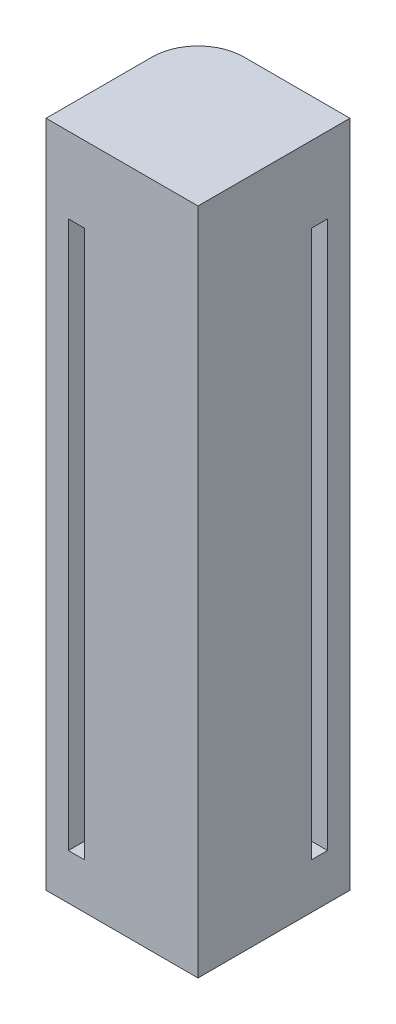
ISO-10303-21;
HEADER;
FILE_DESCRIPTION(('STEP AP214'),'2;1');
FILE_NAME('part.step','',(''),(''),'','','');
FILE_SCHEMA(('AUTOMOTIVE_DESIGN { 1 0 10303 214 1 1 1 1 }'));
ENDSEC;
DATA;
#1=APPLICATION_CONTEXT('core data for automotive mechanical design processes');
#2=APPLICATION_PROTOCOL_DEFINITION('international standard','automotive_design',2000,#1);
#3=PRODUCT_CONTEXT('',#1,'mechanical');
#4=PRODUCT('Part','Part','',(#3));
#5=PRODUCT_RELATED_PRODUCT_CATEGORY('part','',(#4));
#6=PRODUCT_DEFINITION_FORMATION('','',#4);
#7=PRODUCT_DEFINITION_CONTEXT('part definition',#1,'design');
#8=PRODUCT_DEFINITION('design','',#6,#7);
#9=PRODUCT_DEFINITION_SHAPE('','',#8);
#10=(LENGTH_UNIT() NAMED_UNIT(*) SI_UNIT(.MILLI.,.METRE.));
#11=(NAMED_UNIT(*) PLANE_ANGLE_UNIT() SI_UNIT($,.RADIAN.));
#12=(NAMED_UNIT(*) SI_UNIT($,.STERADIAN.) SOLID_ANGLE_UNIT());
#13=UNCERTAINTY_MEASURE_WITH_UNIT(LENGTH_MEASURE(1.E-05),#10,'distance_accuracy_value','');
#14=(GEOMETRIC_REPRESENTATION_CONTEXT(3) GLOBAL_UNCERTAINTY_ASSIGNED_CONTEXT((#13)) GLOBAL_UNIT_ASSIGNED_CONTEXT((#10,
#11,#12)) REPRESENTATION_CONTEXT('',''));
#15=CARTESIAN_POINT('',(0.,0.,0.));
#16=DIRECTION('',(0.,0.,1.));
#17=DIRECTION('',(1.,0.,0.));
#18=AXIS2_PLACEMENT_3D('',#15,#16,#17);
#19=CARTESIAN_POINT('',(0.,139.7,0.));
#20=DIRECTION('',(0.,1.,0.));
#21=DIRECTION('',(0.,0.,1.));
#22=AXIS2_PLACEMENT_3D('',#19,#20,#21);
#23=PLANE('',#22);
#24=DIRECTION('',(1.,0.,0.));
#25=VECTOR('',#24,1.);
#26=CARTESIAN_POINT('',(-228.6,139.7,15.875));
#27=LINE('',#26,#25);
#28=CARTESIAN_POINT('',(-260.35,139.7,15.875));
#29=VERTEX_POINT('',#28);
#30=CARTESIAN_POINT('',(-228.6,139.7,15.875));
#31=VERTEX_POINT('',#30);
#32=EDGE_CURVE('E158',#29,#31,#27,.T.);
#33=ORIENTED_EDGE('',*,*,#32,.T.);
#34=DIRECTION('',(0.,0.,-1.));
#35=VECTOR('',#34,1.);
#36=CARTESIAN_POINT('',(-228.6,139.7,15.875));
#37=LINE('',#36,#35);
#38=CARTESIAN_POINT('',(-228.6,139.7,-15.875));
#39=VERTEX_POINT('',#38);
#40=EDGE_CURVE('E142',#31,#39,#37,.T.);
#41=ORIENTED_EDGE('',*,*,#40,.T.);
#42=DIRECTION('',(-1.,0.,0.));
#43=VECTOR('',#42,1.);
#44=CARTESIAN_POINT('',(-228.6,139.7,-15.875));
#45=LINE('',#44,#43);
#46=CARTESIAN_POINT('',(-250.825,139.7,-15.875));
#47=VERTEX_POINT('',#46);
#48=EDGE_CURVE('E153',#39,#47,#45,.T.);
#49=ORIENTED_EDGE('',*,*,#48,.T.);
#50=CARTESIAN_POINT('',(-250.825,139.7,-6.35));
#51=DIRECTION('',(0.,1.,0.));
#52=DIRECTION('',(0.,0.,1.));
#53=AXIS2_PLACEMENT_3D('',#50,#51,#52);
#54=CIRCLE('',#53,9.525);
#55=CARTESIAN_POINT('',(-260.35,139.7,-6.35));
#56=VERTEX_POINT('',#55);
#57=EDGE_CURVE('E232',#56,#47,#54,.F.);
#58=ORIENTED_EDGE('',*,*,#57,.F.);
#59=DIRECTION('',(0.,0.,-1.));
#60=VECTOR('',#59,1.);
#61=CARTESIAN_POINT('',(-260.35,139.7,0.));
#62=LINE('',#61,#60);
#63=EDGE_CURVE('E157',#29,#56,#62,.T.);
#64=ORIENTED_EDGE('',*,*,#63,.F.);
#65=EDGE_LOOP('',(#33,#41,#49,#58,#64));
#66=FACE_BOUND('',#65,.T.);
#67=ADVANCED_FACE('F34',(#66),#23,.T.);
#68=CARTESIAN_POINT('',(-254.,0.,3.175));
#69=DIRECTION('',(0.,0.,1.));
#70=DIRECTION('',(-1.,0.,0.));
#71=AXIS2_PLACEMENT_3D('',#68,#69,#70);
#72=PLANE('',#71);
#73=DIRECTION('',(0.,1.,0.));
#74=VECTOR('',#73,1.);
#75=CARTESIAN_POINT('',(-255.6764,123.825,3.175));
#76=LINE('',#75,#74);
#77=CARTESIAN_POINT('',(-255.6764,9.52500000000001,3.175));
#78=VERTEX_POINT('',#77);
#79=CARTESIAN_POINT('',(-255.6764,123.825,3.175));
#80=VERTEX_POINT('',#79);
#81=EDGE_CURVE('E194',#78,#80,#76,.T.);
#82=ORIENTED_EDGE('',*,*,#81,.F.);
#83=DIRECTION('',(-1.,0.,0.));
#84=VECTOR('',#83,1.);
#85=CARTESIAN_POINT('',(-252.3236,9.52500000000001,3.175));
#86=LINE('',#85,#84);
#87=CARTESIAN_POINT('',(-252.3236,9.52500000000001,3.175));
#88=VERTEX_POINT('',#87);
#89=EDGE_CURVE('E184',#88,#78,#86,.T.);
#90=ORIENTED_EDGE('',*,*,#89,.F.);
#91=DIRECTION('',(0.,-1.,0.));
#92=VECTOR('',#91,1.);
#93=CARTESIAN_POINT('',(-252.3236,123.825,3.175));
#94=LINE('',#93,#92);
#95=CARTESIAN_POINT('',(-252.3236,123.825,3.175));
#96=VERTEX_POINT('',#95);
#97=EDGE_CURVE('E204',#96,#88,#94,.T.);
#98=ORIENTED_EDGE('',*,*,#97,.F.);
#99=DIRECTION('',(1.,0.,0.));
#100=VECTOR('',#99,1.);
#101=CARTESIAN_POINT('',(-252.3236,123.825,3.175));
#102=LINE('',#101,#100);
#103=EDGE_CURVE('E206',#80,#96,#102,.T.);
#104=ORIENTED_EDGE('',*,*,#103,.F.);
#105=EDGE_LOOP('',(#82,#90,#98,#104));
#106=FACE_BOUND('',#105,.T.);
#107=ADVANCED_FACE('F255',(#106),#72,.T.);
#108=CARTESIAN_POINT('',(-241.3,0.,0.));
#109=DIRECTION('',(-1.,0.,0.));
#110=DIRECTION('',(0.,0.,-1.));
#111=AXIS2_PLACEMENT_3D('',#108,#109,#110);
#112=PLANE('',#111);
#113=DIRECTION('',(0.,-1.,0.));
#114=VECTOR('',#113,1.);
#115=CARTESIAN_POINT('',(-241.3,9.525,-11.2014));
#116=LINE('',#115,#114);
#117=CARTESIAN_POINT('',(-241.3,123.825,-11.2014));
#118=VERTEX_POINT('',#117);
#119=CARTESIAN_POINT('',(-241.3,9.525,-11.2014));
#120=VERTEX_POINT('',#119);
#121=EDGE_CURVE('E221',#118,#120,#116,.T.);
#122=ORIENTED_EDGE('',*,*,#121,.F.);
#123=DIRECTION('',(0.,0.,-1.));
#124=VECTOR('',#123,1.);
#125=CARTESIAN_POINT('',(-241.3,123.825,-11.2014));
#126=LINE('',#125,#124);
#127=CARTESIAN_POINT('',(-241.3,123.825,-7.84860000000001));
#128=VERTEX_POINT('',#127);
#129=EDGE_CURVE('E212',#128,#118,#126,.T.);
#130=ORIENTED_EDGE('',*,*,#129,.F.);
#131=DIRECTION('',(0.,1.,0.));
#132=VECTOR('',#131,1.);
#133=CARTESIAN_POINT('',(-241.3,9.525,-7.84859999999997));
#134=LINE('',#133,#132);
#135=CARTESIAN_POINT('',(-241.3,9.525,-7.84859999999997));
#136=VERTEX_POINT('',#135);
#137=EDGE_CURVE('E227',#136,#128,#134,.T.);
#138=ORIENTED_EDGE('',*,*,#137,.F.);
#139=DIRECTION('',(0.,0.,1.));
#140=VECTOR('',#139,1.);
#141=CARTESIAN_POINT('',(-241.3,9.525,-11.2014));
#142=LINE('',#141,#140);
#143=EDGE_CURVE('E69',#120,#136,#142,.T.);
#144=ORIENTED_EDGE('',*,*,#143,.F.);
#145=EDGE_LOOP('',(#122,#130,#138,#144));
#146=FACE_BOUND('',#145,.T.);
#147=ADVANCED_FACE('F257',(#146),#112,.F.);
#148=CARTESIAN_POINT('',(-255.6764,123.825,3.175));
#149=DIRECTION('',(-1.,0.,0.));
#150=DIRECTION('',(0.,1.,0.));
#151=AXIS2_PLACEMENT_3D('',#148,#149,#150);
#152=PLANE('',#151);
#153=DIRECTION('',(0.,1.,0.));
#154=VECTOR('',#153,1.);
#155=CARTESIAN_POINT('',(-255.6764,123.825,15.875));
#156=LINE('',#155,#154);
#157=CARTESIAN_POINT('',(-255.6764,9.52500000000001,15.875));
#158=VERTEX_POINT('',#157);
#159=CARTESIAN_POINT('',(-255.6764,123.825,15.875));
#160=VERTEX_POINT('',#159);
#161=EDGE_CURVE('E200',#158,#160,#156,.T.);
#162=ORIENTED_EDGE('',*,*,#161,.F.);
#163=DIRECTION('',(0.,0.,1.));
#164=VECTOR('',#163,1.);
#165=CARTESIAN_POINT('',(-255.6764,9.52500000000001,3.175));
#166=LINE('',#165,#164);
#167=EDGE_CURVE('E181',#78,#158,#166,.T.);
#168=ORIENTED_EDGE('',*,*,#167,.F.);
#169=ORIENTED_EDGE('',*,*,#81,.T.);
#170=DIRECTION('',(0.,0.,1.));
#171=VECTOR('',#170,1.);
#172=CARTESIAN_POINT('',(-255.6764,123.825,3.175));
#173=LINE('',#172,#171);
#174=EDGE_CURVE('E182',#80,#160,#173,.T.);
#175=ORIENTED_EDGE('',*,*,#174,.T.);
#176=EDGE_LOOP('',(#162,#168,#169,#175));
#177=FACE_BOUND('',#176,.T.);
#178=ADVANCED_FACE('F264',(#177),#152,.F.);
#179=CARTESIAN_POINT('',(-252.3236,9.52500000000001,3.175));
#180=DIRECTION('',(0.,-1.,0.));
#181=DIRECTION('',(0.,0.,-1.));
#182=AXIS2_PLACEMENT_3D('',#179,#180,#181);
#183=PLANE('',#182);
#184=DIRECTION('',(-1.,0.,0.));
#185=VECTOR('',#184,1.);
#186=CARTESIAN_POINT('',(-252.3236,9.52500000000001,15.875));
#187=LINE('',#186,#185);
#188=CARTESIAN_POINT('',(-252.3236,9.52500000000001,15.875));
#189=VERTEX_POINT('',#188);
#190=EDGE_CURVE('E190',#189,#158,#187,.T.);
#191=ORIENTED_EDGE('',*,*,#190,.F.);
#192=DIRECTION('',(0.,0.,1.));
#193=VECTOR('',#192,1.);
#194=CARTESIAN_POINT('',(-252.3236,9.52500000000001,3.175));
#195=LINE('',#194,#193);
#196=EDGE_CURVE('E187',#88,#189,#195,.T.);
#197=ORIENTED_EDGE('',*,*,#196,.F.);
#198=ORIENTED_EDGE('',*,*,#89,.T.);
#199=ORIENTED_EDGE('',*,*,#167,.T.);
#200=EDGE_LOOP('',(#191,#197,#198,#199));
#201=FACE_BOUND('',#200,.T.);
#202=ADVANCED_FACE('F271',(#201),#183,.F.);
#203=CARTESIAN_POINT('',(-252.3236,123.825,3.175));
#204=DIRECTION('',(1.,0.,0.));
#205=DIRECTION('',(0.,-1.,0.));
#206=AXIS2_PLACEMENT_3D('',#203,#204,#205);
#207=PLANE('',#206);
#208=DIRECTION('',(0.,-1.,0.));
#209=VECTOR('',#208,1.);
#210=CARTESIAN_POINT('',(-252.3236,123.825,15.875));
#211=LINE('',#210,#209);
#212=CARTESIAN_POINT('',(-252.3236,123.825,15.875));
#213=VERTEX_POINT('',#212);
#214=EDGE_CURVE('E193',#213,#189,#211,.T.);
#215=ORIENTED_EDGE('',*,*,#214,.F.);
#216=DIRECTION('',(0.,0.,1.));
#217=VECTOR('',#216,1.);
#218=CARTESIAN_POINT('',(-252.3236,123.825,3.175));
#219=LINE('',#218,#217);
#220=EDGE_CURVE('E185',#96,#213,#219,.T.);
#221=ORIENTED_EDGE('',*,*,#220,.F.);
#222=ORIENTED_EDGE('',*,*,#97,.T.);
#223=ORIENTED_EDGE('',*,*,#196,.T.);
#224=EDGE_LOOP('',(#215,#221,#222,#223));
#225=FACE_BOUND('',#224,.T.);
#226=ADVANCED_FACE('F354',(#225),#207,.F.);
#227=CARTESIAN_POINT('',(-252.3236,123.825,3.175));
#228=DIRECTION('',(0.,1.,0.));
#229=DIRECTION('',(0.,0.,1.));
#230=AXIS2_PLACEMENT_3D('',#227,#228,#229);
#231=PLANE('',#230);
#232=DIRECTION('',(1.,0.,0.));
#233=VECTOR('',#232,1.);
#234=CARTESIAN_POINT('',(-252.3236,123.825,15.875));
#235=LINE('',#234,#233);
#236=EDGE_CURVE('E197',#160,#213,#235,.T.);
#237=ORIENTED_EDGE('',*,*,#236,.F.);
#238=ORIENTED_EDGE('',*,*,#174,.F.);
#239=ORIENTED_EDGE('',*,*,#103,.T.);
#240=ORIENTED_EDGE('',*,*,#220,.T.);
#241=EDGE_LOOP('',(#237,#238,#239,#240));
#242=FACE_BOUND('',#241,.T.);
#243=ADVANCED_FACE('F251',(#242),#231,.F.);
#244=CARTESIAN_POINT('',(-228.6,279.4,15.875));
#245=DIRECTION('',(0.,0.,-1.));
#246=DIRECTION('',(1.,0.,0.));
#247=AXIS2_PLACEMENT_3D('',#244,#245,#246);
#248=PLANE('',#247);
#249=ORIENTED_EDGE('',*,*,#236,.T.);
#250=ORIENTED_EDGE('',*,*,#214,.T.);
#251=ORIENTED_EDGE('',*,*,#190,.T.);
#252=ORIENTED_EDGE('',*,*,#161,.T.);
#253=EDGE_LOOP('',(#249,#250,#251,#252));
#254=FACE_BOUND('',#253,.T.);
#255=ORIENTED_EDGE('',*,*,#32,.F.);
#256=DIRECTION('',(0.,-1.,0.));
#257=VECTOR('',#256,1.);
#258=CARTESIAN_POINT('',(-260.35,279.4,15.875));
#259=LINE('',#258,#257);
#260=CARTESIAN_POINT('',(-260.35,0.,15.875));
#261=VERTEX_POINT('',#260);
#262=EDGE_CURVE('E38',#29,#261,#259,.T.);
#263=ORIENTED_EDGE('',*,*,#262,.T.);
#264=DIRECTION('',(-1.,0.,0.));
#265=VECTOR('',#264,1.);
#266=CARTESIAN_POINT('',(-228.6,0.,15.875));
#267=LINE('',#266,#265);
#268=CARTESIAN_POINT('',(-228.6,0.,15.875));
#269=VERTEX_POINT('',#268);
#270=EDGE_CURVE('E169',#269,#261,#267,.T.);
#271=ORIENTED_EDGE('',*,*,#270,.F.);
#272=DIRECTION('',(0.,-1.,0.));
#273=VECTOR('',#272,1.);
#274=CARTESIAN_POINT('',(-228.6,279.4,15.875));
#275=LINE('',#274,#273);
#276=EDGE_CURVE('E148',#31,#269,#275,.T.);
#277=ORIENTED_EDGE('',*,*,#276,.F.);
#278=EDGE_LOOP('',(#255,#263,#271,#277));
#279=FACE_BOUND('',#278,.T.);
#280=ADVANCED_FACE('F244',(#254,#279),#248,.F.);
#281=CARTESIAN_POINT('',(-254.,0.,0.));
#282=DIRECTION('',(0.,-1.,0.));
#283=DIRECTION('',(0.,0.,-1.));
#284=AXIS2_PLACEMENT_3D('',#281,#282,#283);
#285=PLANE('',#284);
#286=DIRECTION('',(1.,0.,0.));
#287=VECTOR('',#286,1.);
#288=CARTESIAN_POINT('',(-228.6,0.,-15.875));
#289=LINE('',#288,#287);
#290=CARTESIAN_POINT('',(-250.825,0.,-15.875));
#291=VERTEX_POINT('',#290);
#292=CARTESIAN_POINT('',(-228.6,0.,-15.875));
#293=VERTEX_POINT('',#292);
#294=EDGE_CURVE('E175',#291,#293,#289,.T.);
#295=ORIENTED_EDGE('',*,*,#294,.T.);
#296=DIRECTION('',(0.,0.,1.));
#297=VECTOR('',#296,1.);
#298=CARTESIAN_POINT('',(-228.6,0.,15.875));
#299=LINE('',#298,#297);
#300=EDGE_CURVE('E144',#293,#269,#299,.T.);
#301=ORIENTED_EDGE('',*,*,#300,.T.);
#302=ORIENTED_EDGE('',*,*,#270,.T.);
#303=DIRECTION('',(0.,0.,1.));
#304=VECTOR('',#303,1.);
#305=CARTESIAN_POINT('',(-260.35,0.,0.));
#306=LINE('',#305,#304);
#307=CARTESIAN_POINT('',(-260.35,0.,-6.35));
#308=VERTEX_POINT('',#307);
#309=EDGE_CURVE('E149',#308,#261,#306,.T.);
#310=ORIENTED_EDGE('',*,*,#309,.F.);
#311=CARTESIAN_POINT('',(-250.825,0.,-6.35));
#312=DIRECTION('',(0.,1.,0.));
#313=DIRECTION('',(0.,0.,-1.));
#314=AXIS2_PLACEMENT_3D('',#311,#312,#313);
#315=CIRCLE('',#314,9.525);
#316=EDGE_CURVE('E168',#291,#308,#315,.T.);
#317=ORIENTED_EDGE('',*,*,#316,.F.);
#318=EDGE_LOOP('',(#295,#301,#302,#310,#317));
#319=FACE_BOUND('',#318,.T.);
#320=ADVANCED_FACE('F242',(#319),#285,.T.);
#321=CARTESIAN_POINT('',(-228.6,279.4,-15.875));
#322=DIRECTION('',(0.,0.,1.));
#323=DIRECTION('',(-1.,0.,0.));
#324=AXIS2_PLACEMENT_3D('',#321,#322,#323);
#325=PLANE('',#324);
#326=ORIENTED_EDGE('',*,*,#48,.F.);
#327=DIRECTION('',(0.,-1.,0.));
#328=VECTOR('',#327,1.);
#329=CARTESIAN_POINT('',(-228.6,279.4,-15.875));
#330=LINE('',#329,#328);
#331=EDGE_CURVE('E138',#39,#293,#330,.T.);
#332=ORIENTED_EDGE('',*,*,#331,.T.);
#333=ORIENTED_EDGE('',*,*,#294,.F.);
#334=DIRECTION('',(0.,1.,0.));
#335=VECTOR('',#334,1.);
#336=CARTESIAN_POINT('',(-250.825,0.,-15.875));
#337=LINE('',#336,#335);
#338=EDGE_CURVE('E155',#47,#291,#337,.F.);
#339=ORIENTED_EDGE('',*,*,#338,.F.);
#340=EDGE_LOOP('',(#326,#332,#333,#339));
#341=FACE_BOUND('',#340,.T.);
#342=ADVANCED_FACE('F154',(#341),#325,.F.);
#343=CARTESIAN_POINT('',(-260.35,0.,0.));
#344=DIRECTION('',(-1.,0.,0.));
#345=DIRECTION('',(0.,0.,-1.));
#346=AXIS2_PLACEMENT_3D('',#343,#344,#345);
#347=PLANE('',#346);
#348=ORIENTED_EDGE('',*,*,#262,.F.);
#349=ORIENTED_EDGE('',*,*,#63,.T.);
#350=DIRECTION('',(0.,1.,0.));
#351=VECTOR('',#350,1.);
#352=CARTESIAN_POINT('',(-260.35,292.1,-6.35));
#353=LINE('',#352,#351);
#354=EDGE_CURVE('E165',#308,#56,#353,.T.);
#355=ORIENTED_EDGE('',*,*,#354,.F.);
#356=ORIENTED_EDGE('',*,*,#309,.T.);
#357=EDGE_LOOP('',(#348,#349,#355,#356));
#358=FACE_BOUND('',#357,.T.);
#359=ADVANCED_FACE('F237',(#358),#347,.T.);
#360=CARTESIAN_POINT('',(-250.825,0.,-6.35));
#361=DIRECTION('',(0.,-1.,0.));
#362=DIRECTION('',(0.,0.,-1.));
#363=AXIS2_PLACEMENT_3D('',#360,#361,#362);
#364=CYLINDRICAL_SURFACE('',#363,9.525);
#365=ORIENTED_EDGE('',*,*,#354,.T.);
#366=ORIENTED_EDGE('',*,*,#57,.T.);
#367=ORIENTED_EDGE('',*,*,#338,.T.);
#368=ORIENTED_EDGE('',*,*,#316,.T.);
#369=EDGE_LOOP('',(#365,#366,#367,#368));
#370=FACE_BOUND('',#369,.T.);
#371=ADVANCED_FACE('F36',(#370),#364,.T.);
#372=CARTESIAN_POINT('',(-241.3,9.525,-11.2014));
#373=DIRECTION('',(0.,0.,-1.));
#374=DIRECTION('',(0.,1.,0.));
#375=AXIS2_PLACEMENT_3D('',#372,#373,#374);
#376=PLANE('',#375);
#377=DIRECTION('',(0.,-1.,0.));
#378=VECTOR('',#377,1.);
#379=CARTESIAN_POINT('',(-228.6,9.525,-11.2014));
#380=LINE('',#379,#378);
#381=CARTESIAN_POINT('',(-228.6,123.825,-11.2014));
#382=VERTEX_POINT('',#381);
#383=CARTESIAN_POINT('',(-228.6,9.52500000000001,-11.2014));
#384=VERTEX_POINT('',#383);
#385=EDGE_CURVE('E11',#382,#384,#380,.T.);
#386=ORIENTED_EDGE('',*,*,#385,.F.);
#387=DIRECTION('',(1.,0.,0.));
#388=VECTOR('',#387,1.);
#389=CARTESIAN_POINT('',(-241.3,123.825,-11.2014));
#390=LINE('',#389,#388);
#391=EDGE_CURVE('E77',#118,#382,#390,.T.);
#392=ORIENTED_EDGE('',*,*,#391,.F.);
#393=ORIENTED_EDGE('',*,*,#121,.T.);
#394=DIRECTION('',(1.,0.,0.));
#395=VECTOR('',#394,1.);
#396=CARTESIAN_POINT('',(-241.3,9.525,-11.2014));
#397=LINE('',#396,#395);
#398=EDGE_CURVE('E210',#120,#384,#397,.T.);
#399=ORIENTED_EDGE('',*,*,#398,.T.);
#400=EDGE_LOOP('',(#386,#392,#393,#399));
#401=FACE_BOUND('',#400,.T.);
#402=ADVANCED_FACE('F273',(#401),#376,.F.);
#403=CARTESIAN_POINT('',(-241.3,123.825,-11.2014));
#404=DIRECTION('',(0.,1.,0.));
#405=DIRECTION('',(0.,0.,1.));
#406=AXIS2_PLACEMENT_3D('',#403,#404,#405);
#407=PLANE('',#406);
#408=DIRECTION('',(0.,0.,-1.));
#409=VECTOR('',#408,1.);
#410=CARTESIAN_POINT('',(-228.6,123.825,-11.2014));
#411=LINE('',#410,#409);
#412=CARTESIAN_POINT('',(-228.6,123.825,-7.84860000000001));
#413=VERTEX_POINT('',#412);
#414=EDGE_CURVE('E217',#413,#382,#411,.T.);
#415=ORIENTED_EDGE('',*,*,#414,.F.);
#416=DIRECTION('',(1.,0.,0.));
#417=VECTOR('',#416,1.);
#418=CARTESIAN_POINT('',(-241.3,123.825,-7.84860000000001));
#419=LINE('',#418,#417);
#420=EDGE_CURVE('E214',#128,#413,#419,.T.);
#421=ORIENTED_EDGE('',*,*,#420,.F.);
#422=ORIENTED_EDGE('',*,*,#129,.T.);
#423=ORIENTED_EDGE('',*,*,#391,.T.);
#424=EDGE_LOOP('',(#415,#421,#422,#423));
#425=FACE_BOUND('',#424,.T.);
#426=ADVANCED_FACE('F276',(#425),#407,.F.);
#427=CARTESIAN_POINT('',(-241.3,9.525,-7.84859999999997));
#428=DIRECTION('',(0.,0.,1.));
#429=DIRECTION('',(0.,-1.,0.));
#430=AXIS2_PLACEMENT_3D('',#427,#428,#429);
#431=PLANE('',#430);
#432=DIRECTION('',(0.,1.,0.));
#433=VECTOR('',#432,1.);
#434=CARTESIAN_POINT('',(-228.6,9.525,-7.84859999999997));
#435=LINE('',#434,#433);
#436=CARTESIAN_POINT('',(-228.6,9.525,-7.84859999999997));
#437=VERTEX_POINT('',#436);
#438=EDGE_CURVE('E220',#437,#413,#435,.T.);
#439=ORIENTED_EDGE('',*,*,#438,.F.);
#440=DIRECTION('',(1.,0.,0.));
#441=VECTOR('',#440,1.);
#442=CARTESIAN_POINT('',(-241.3,9.525,-7.84859999999997));
#443=LINE('',#442,#441);
#444=EDGE_CURVE('E53',#136,#437,#443,.T.);
#445=ORIENTED_EDGE('',*,*,#444,.F.);
#446=ORIENTED_EDGE('',*,*,#137,.T.);
#447=ORIENTED_EDGE('',*,*,#420,.T.);
#448=EDGE_LOOP('',(#439,#445,#446,#447));
#449=FACE_BOUND('',#448,.T.);
#450=ADVANCED_FACE('F281',(#449),#431,.F.);
#451=CARTESIAN_POINT('',(-241.3,9.525,-11.2014));
#452=DIRECTION('',(0.,-1.,0.));
#453=DIRECTION('',(0.,0.,-1.));
#454=AXIS2_PLACEMENT_3D('',#451,#452,#453);
#455=PLANE('',#454);
#456=DIRECTION('',(0.,0.,1.));
#457=VECTOR('',#456,1.);
#458=CARTESIAN_POINT('',(-228.6,9.525,-11.2014));
#459=LINE('',#458,#457);
#460=EDGE_CURVE('E44',#384,#437,#459,.T.);
#461=ORIENTED_EDGE('',*,*,#460,.F.);
#462=ORIENTED_EDGE('',*,*,#398,.F.);
#463=ORIENTED_EDGE('',*,*,#143,.T.);
#464=ORIENTED_EDGE('',*,*,#444,.T.);
#465=EDGE_LOOP('',(#461,#462,#463,#464));
#466=FACE_BOUND('',#465,.T.);
#467=ADVANCED_FACE('F278',(#466),#455,.F.);
#468=CARTESIAN_POINT('',(-228.6,279.4,15.875));
#469=DIRECTION('',(-1.,0.,0.));
#470=DIRECTION('',(0.,0.,-1.));
#471=AXIS2_PLACEMENT_3D('',#468,#469,#470);
#472=PLANE('',#471);
#473=ORIENTED_EDGE('',*,*,#460,.T.);
#474=ORIENTED_EDGE('',*,*,#438,.T.);
#475=ORIENTED_EDGE('',*,*,#414,.T.);
#476=ORIENTED_EDGE('',*,*,#385,.T.);
#477=EDGE_LOOP('',(#473,#474,#475,#476));
#478=FACE_BOUND('',#477,.T.);
#479=ORIENTED_EDGE('',*,*,#40,.F.);
#480=ORIENTED_EDGE('',*,*,#276,.T.);
#481=ORIENTED_EDGE('',*,*,#300,.F.);
#482=ORIENTED_EDGE('',*,*,#331,.F.);
#483=EDGE_LOOP('',(#479,#480,#481,#482));
#484=FACE_BOUND('',#483,.T.);
#485=ADVANCED_FACE('F140',(#478,#484),#472,.F.);
#486=CLOSED_SHELL('',(#67,#107,#147,#178,#202,#226,#243,#280,#320,#342,#359,#371,#402,#426,#450,
#467,#485));
#487=MANIFOLD_SOLID_BREP('B2',#486);
#488=ADVANCED_BREP_SHAPE_REPRESENTATION('',(#18,#487),#14);
#489=SHAPE_DEFINITION_REPRESENTATION(#9,#488);
ENDSEC;
END-ISO-10303-21;
